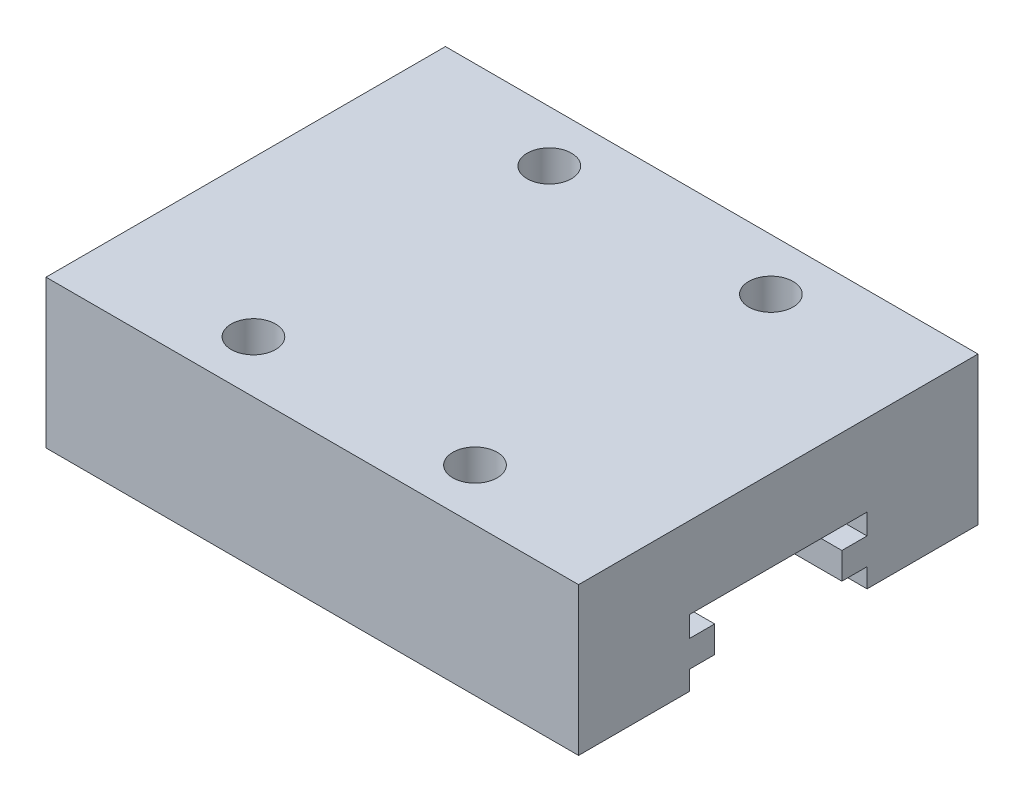
ISO-10303-21;
HEADER;
FILE_DESCRIPTION(('STEP AP214'),'2;1');
FILE_NAME('part.step','',(''),(''),'','','');
FILE_SCHEMA(('AUTOMOTIVE_DESIGN { 1 0 10303 214 1 1 1 1 }'));
ENDSEC;
DATA;
#1=APPLICATION_CONTEXT('core data for automotive mechanical design processes');
#2=APPLICATION_PROTOCOL_DEFINITION('international standard','automotive_design',2000,#1);
#3=PRODUCT_CONTEXT('',#1,'mechanical');
#4=PRODUCT('Part','Part','',(#3));
#5=PRODUCT_RELATED_PRODUCT_CATEGORY('part','',(#4));
#6=PRODUCT_DEFINITION_FORMATION('','',#4);
#7=PRODUCT_DEFINITION_CONTEXT('part definition',#1,'design');
#8=PRODUCT_DEFINITION('design','',#6,#7);
#9=PRODUCT_DEFINITION_SHAPE('','',#8);
#10=(LENGTH_UNIT() NAMED_UNIT(*) SI_UNIT(.MILLI.,.METRE.));
#11=(NAMED_UNIT(*) PLANE_ANGLE_UNIT() SI_UNIT($,.RADIAN.));
#12=(NAMED_UNIT(*) SI_UNIT($,.STERADIAN.) SOLID_ANGLE_UNIT());
#13=UNCERTAINTY_MEASURE_WITH_UNIT(LENGTH_MEASURE(1.E-05),#10,'distance_accuracy_value','');
#14=(GEOMETRIC_REPRESENTATION_CONTEXT(3) GLOBAL_UNCERTAINTY_ASSIGNED_CONTEXT((#13)) GLOBAL_UNIT_ASSIGNED_CONTEXT((#10,
#11,#12)) REPRESENTATION_CONTEXT('',''));
#15=CARTESIAN_POINT('',(0.,0.,0.));
#16=DIRECTION('',(0.,0.,1.));
#17=DIRECTION('',(1.,0.,0.));
#18=AXIS2_PLACEMENT_3D('',#15,#16,#17);
#19=CARTESIAN_POINT('',(0.,0.,0.));
#20=DIRECTION('',(0.,-1.,0.));
#21=DIRECTION('',(0.,0.,-1.));
#22=AXIS2_PLACEMENT_3D('',#19,#20,#21);
#23=PLANE('',#22);
#24=DIRECTION('',(1.,0.,0.));
#25=VECTOR('',#24,1.);
#26=CARTESIAN_POINT('',(-12.8160056179763,0.,-7.5));
#27=LINE('',#26,#25);
#28=CARTESIAN_POINT('',(0.,0.,-7.5));
#29=VERTEX_POINT('',#28);
#30=CARTESIAN_POINT('',(36.,0.,-7.5));
#31=VERTEX_POINT('',#30);
#32=EDGE_CURVE('E198',#29,#31,#27,.T.);
#33=ORIENTED_EDGE('',*,*,#32,.T.);
#34=DIRECTION('',(0.,0.,-1.));
#35=VECTOR('',#34,1.);
#36=CARTESIAN_POINT('',(36.,0.,0.));
#37=LINE('',#36,#35);
#38=CARTESIAN_POINT('',(36.,0.,0.));
#39=VERTEX_POINT('',#38);
#40=EDGE_CURVE('E213',#39,#31,#37,.T.);
#41=ORIENTED_EDGE('',*,*,#40,.F.);
#42=DIRECTION('',(1.,0.,0.));
#43=VECTOR('',#42,1.);
#44=CARTESIAN_POINT('',(0.,0.,0.));
#45=LINE('',#44,#43);
#46=CARTESIAN_POINT('',(0.,0.,0.));
#47=VERTEX_POINT('',#46);
#48=EDGE_CURVE('E230',#47,#39,#45,.T.);
#49=ORIENTED_EDGE('',*,*,#48,.F.);
#50=DIRECTION('',(0.,0.,1.));
#51=VECTOR('',#50,1.);
#52=CARTESIAN_POINT('',(0.,0.,0.));
#53=LINE('',#52,#51);
#54=EDGE_CURVE('E214',#29,#47,#53,.T.);
#55=ORIENTED_EDGE('',*,*,#54,.F.);
#56=EDGE_LOOP('',(#33,#41,#49,#55));
#57=FACE_BOUND('',#56,.T.);
#58=ADVANCED_FACE('F40',(#57),#23,.T.);
#59=CARTESIAN_POINT('',(0.,10.,0.));
#60=DIRECTION('',(1.,0.,0.));
#61=DIRECTION('',(0.,0.,-1.));
#62=AXIS2_PLACEMENT_3D('',#59,#60,#61);
#63=PLANE('',#62);
#64=DIRECTION('',(0.,0.,-1.));
#65=VECTOR('',#64,1.);
#66=CARTESIAN_POINT('',(0.,1.3,-7.5));
#67=LINE('',#66,#65);
#68=CARTESIAN_POINT('',(0.,1.3,-7.5));
#69=VERTEX_POINT('',#68);
#70=CARTESIAN_POINT('',(0.,1.3,-9.2));
#71=VERTEX_POINT('',#70);
#72=EDGE_CURVE('E365',#69,#71,#67,.T.);
#73=ORIENTED_EDGE('',*,*,#72,.F.);
#74=DIRECTION('',(0.,1.,0.));
#75=VECTOR('',#74,1.);
#76=CARTESIAN_POINT('',(0.,0.,-7.5));
#77=LINE('',#76,#75);
#78=EDGE_CURVE('E293',#29,#69,#77,.T.);
#79=ORIENTED_EDGE('',*,*,#78,.F.);
#80=ORIENTED_EDGE('',*,*,#54,.T.);
#81=DIRECTION('',(0.,-1.,0.));
#82=VECTOR('',#81,1.);
#83=CARTESIAN_POINT('',(0.,10.,0.));
#84=LINE('',#83,#82);
#85=CARTESIAN_POINT('',(0.,10.,0.));
#86=VERTEX_POINT('',#85);
#87=EDGE_CURVE('E11',#86,#47,#84,.T.);
#88=ORIENTED_EDGE('',*,*,#87,.F.);
#89=DIRECTION('',(0.,0.,1.));
#90=VECTOR('',#89,1.);
#91=CARTESIAN_POINT('',(0.,10.,0.));
#92=LINE('',#91,#90);
#93=CARTESIAN_POINT('',(0.,10.,-27.));
#94=VERTEX_POINT('',#93);
#95=EDGE_CURVE('E227',#94,#86,#92,.T.);
#96=ORIENTED_EDGE('',*,*,#95,.F.);
#97=DIRECTION('',(0.,-1.,0.));
#98=VECTOR('',#97,1.);
#99=CARTESIAN_POINT('',(0.,10.,-27.));
#100=LINE('',#99,#98);
#101=CARTESIAN_POINT('',(0.,0.,-27.));
#102=VERTEX_POINT('',#101);
#103=EDGE_CURVE('E234',#94,#102,#100,.T.);
#104=ORIENTED_EDGE('',*,*,#103,.T.);
#105=CARTESIAN_POINT('',(0.,0.,-19.5));
#106=VERTEX_POINT('',#105);
#107=EDGE_CURVE('E248',#102,#106,#53,.T.);
#108=ORIENTED_EDGE('',*,*,#107,.T.);
#109=DIRECTION('',(0.,-1.,0.));
#110=VECTOR('',#109,1.);
#111=CARTESIAN_POINT('',(0.,0.,-19.5));
#112=LINE('',#111,#110);
#113=CARTESIAN_POINT('',(0.,1.3,-19.5));
#114=VERTEX_POINT('',#113);
#115=EDGE_CURVE('E59',#114,#106,#112,.T.);
#116=ORIENTED_EDGE('',*,*,#115,.F.);
#117=DIRECTION('',(0.,0.,-1.));
#118=VECTOR('',#117,1.);
#119=CARTESIAN_POINT('',(0.,1.3,-19.5));
#120=LINE('',#119,#118);
#121=CARTESIAN_POINT('',(0.,1.3,-17.8));
#122=VERTEX_POINT('',#121);
#123=EDGE_CURVE('E389',#122,#114,#120,.T.);
#124=ORIENTED_EDGE('',*,*,#123,.F.);
#125=DIRECTION('',(0.,-1.,0.));
#126=VECTOR('',#125,1.);
#127=CARTESIAN_POINT('',(0.,3.1,-17.8));
#128=LINE('',#127,#126);
#129=CARTESIAN_POINT('',(0.,3.1,-17.8));
#130=VERTEX_POINT('',#129);
#131=EDGE_CURVE('E386',#130,#122,#128,.T.);
#132=ORIENTED_EDGE('',*,*,#131,.F.);
#133=DIRECTION('',(0.,0.,1.));
#134=VECTOR('',#133,1.);
#135=CARTESIAN_POINT('',(0.,3.1,-19.5));
#136=LINE('',#135,#134);
#137=CARTESIAN_POINT('',(0.,3.1,-19.5));
#138=VERTEX_POINT('',#137);
#139=EDGE_CURVE('E383',#138,#130,#136,.T.);
#140=ORIENTED_EDGE('',*,*,#139,.F.);
#141=DIRECTION('',(0.,-1.,0.));
#142=VECTOR('',#141,1.);
#143=CARTESIAN_POINT('',(0.,3.1,-19.5));
#144=LINE('',#143,#142);
#145=CARTESIAN_POINT('',(0.,4.5,-19.5));
#146=VERTEX_POINT('',#145);
#147=EDGE_CURVE('E380',#146,#138,#144,.T.);
#148=ORIENTED_EDGE('',*,*,#147,.F.);
#149=DIRECTION('',(0.,0.,-1.));
#150=VECTOR('',#149,1.);
#151=CARTESIAN_POINT('',(0.,4.5,-7.5));
#152=LINE('',#151,#150);
#153=CARTESIAN_POINT('',(0.,4.5,-7.5));
#154=VERTEX_POINT('',#153);
#155=EDGE_CURVE('E377',#154,#146,#152,.T.);
#156=ORIENTED_EDGE('',*,*,#155,.F.);
#157=DIRECTION('',(0.,1.,0.));
#158=VECTOR('',#157,1.);
#159=CARTESIAN_POINT('',(0.,3.1,-7.5));
#160=LINE('',#159,#158);
#161=CARTESIAN_POINT('',(0.,3.1,-7.5));
#162=VERTEX_POINT('',#161);
#163=EDGE_CURVE('E374',#162,#154,#160,.T.);
#164=ORIENTED_EDGE('',*,*,#163,.F.);
#165=DIRECTION('',(0.,0.,1.));
#166=VECTOR('',#165,1.);
#167=CARTESIAN_POINT('',(0.,3.1,-7.5));
#168=LINE('',#167,#166);
#169=CARTESIAN_POINT('',(0.,3.1,-9.2));
#170=VERTEX_POINT('',#169);
#171=EDGE_CURVE('E371',#170,#162,#168,.T.);
#172=ORIENTED_EDGE('',*,*,#171,.F.);
#173=DIRECTION('',(0.,1.,0.));
#174=VECTOR('',#173,1.);
#175=CARTESIAN_POINT('',(0.,3.1,-9.2));
#176=LINE('',#175,#174);
#177=EDGE_CURVE('E368',#71,#170,#176,.T.);
#178=ORIENTED_EDGE('',*,*,#177,.F.);
#179=EDGE_LOOP('',(#73,#79,#80,#88,#96,#104,#108,#116,#124,#132,#140,#148,#156,#164,#172,#178));
#180=FACE_BOUND('',#179,.T.);
#181=ADVANCED_FACE('F42',(#180),#63,.F.);
#182=CARTESIAN_POINT('',(0.,10.,0.));
#183=DIRECTION('',(0.,0.,-1.));
#184=DIRECTION('',(-1.,0.,0.));
#185=AXIS2_PLACEMENT_3D('',#182,#183,#184);
#186=PLANE('',#185);
#187=ORIENTED_EDGE('',*,*,#48,.T.);
#188=DIRECTION('',(0.,-1.,0.));
#189=VECTOR('',#188,1.);
#190=CARTESIAN_POINT('',(36.,10.,0.));
#191=LINE('',#190,#189);
#192=CARTESIAN_POINT('',(36.,10.,0.));
#193=VERTEX_POINT('',#192);
#194=EDGE_CURVE('E49',#193,#39,#191,.T.);
#195=ORIENTED_EDGE('',*,*,#194,.F.);
#196=DIRECTION('',(1.,0.,0.));
#197=VECTOR('',#196,1.);
#198=CARTESIAN_POINT('',(0.,10.,0.));
#199=LINE('',#198,#197);
#200=EDGE_CURVE('E105',#86,#193,#199,.T.);
#201=ORIENTED_EDGE('',*,*,#200,.F.);
#202=ORIENTED_EDGE('',*,*,#87,.T.);
#203=EDGE_LOOP('',(#187,#195,#201,#202));
#204=FACE_BOUND('',#203,.T.);
#205=ADVANCED_FACE('F403',(#204),#186,.F.);
#206=CARTESIAN_POINT('',(36.,10.,0.));
#207=DIRECTION('',(-1.,0.,0.));
#208=DIRECTION('',(0.,0.,1.));
#209=AXIS2_PLACEMENT_3D('',#206,#207,#208);
#210=PLANE('',#209);
#211=ORIENTED_EDGE('',*,*,#40,.T.);
#212=DIRECTION('',(0.,-1.,0.));
#213=VECTOR('',#212,1.);
#214=CARTESIAN_POINT('',(36.,0.,-7.5));
#215=LINE('',#214,#213);
#216=CARTESIAN_POINT('',(36.,1.3,-7.5));
#217=VERTEX_POINT('',#216);
#218=EDGE_CURVE('E195',#217,#31,#215,.T.);
#219=ORIENTED_EDGE('',*,*,#218,.F.);
#220=DIRECTION('',(0.,0.,1.));
#221=VECTOR('',#220,1.);
#222=CARTESIAN_POINT('',(36.,1.3,-7.5));
#223=LINE('',#222,#221);
#224=CARTESIAN_POINT('',(36.,1.3,-9.2));
#225=VERTEX_POINT('',#224);
#226=EDGE_CURVE('E217',#225,#217,#223,.T.);
#227=ORIENTED_EDGE('',*,*,#226,.F.);
#228=DIRECTION('',(0.,-1.,0.));
#229=VECTOR('',#228,1.);
#230=CARTESIAN_POINT('',(36.,3.1,-9.2));
#231=LINE('',#230,#229);
#232=CARTESIAN_POINT('',(36.,3.1,-9.2));
#233=VERTEX_POINT('',#232);
#234=EDGE_CURVE('E329',#233,#225,#231,.T.);
#235=ORIENTED_EDGE('',*,*,#234,.F.);
#236=DIRECTION('',(0.,0.,-1.));
#237=VECTOR('',#236,1.);
#238=CARTESIAN_POINT('',(36.,3.1,-7.5));
#239=LINE('',#238,#237);
#240=CARTESIAN_POINT('',(36.,3.1,-7.5));
#241=VERTEX_POINT('',#240);
#242=EDGE_CURVE('E332',#241,#233,#239,.T.);
#243=ORIENTED_EDGE('',*,*,#242,.F.);
#244=DIRECTION('',(0.,-1.,0.));
#245=VECTOR('',#244,1.);
#246=CARTESIAN_POINT('',(36.,3.1,-7.5));
#247=LINE('',#246,#245);
#248=CARTESIAN_POINT('',(36.,4.5,-7.5));
#249=VERTEX_POINT('',#248);
#250=EDGE_CURVE('E336',#249,#241,#247,.T.);
#251=ORIENTED_EDGE('',*,*,#250,.F.);
#252=DIRECTION('',(0.,0.,1.));
#253=VECTOR('',#252,1.);
#254=CARTESIAN_POINT('',(36.,4.5,-7.5));
#255=LINE('',#254,#253);
#256=CARTESIAN_POINT('',(36.,4.5,-19.5));
#257=VERTEX_POINT('',#256);
#258=EDGE_CURVE('E340',#257,#249,#255,.T.);
#259=ORIENTED_EDGE('',*,*,#258,.F.);
#260=DIRECTION('',(0.,1.,0.));
#261=VECTOR('',#260,1.);
#262=CARTESIAN_POINT('',(36.,3.1,-19.5));
#263=LINE('',#262,#261);
#264=CARTESIAN_POINT('',(36.,3.1,-19.5));
#265=VERTEX_POINT('',#264);
#266=EDGE_CURVE('E344',#265,#257,#263,.T.);
#267=ORIENTED_EDGE('',*,*,#266,.F.);
#268=DIRECTION('',(0.,0.,-1.));
#269=VECTOR('',#268,1.);
#270=CARTESIAN_POINT('',(36.,3.1,-19.5));
#271=LINE('',#270,#269);
#272=CARTESIAN_POINT('',(36.,3.1,-17.8));
#273=VERTEX_POINT('',#272);
#274=EDGE_CURVE('E348',#273,#265,#271,.T.);
#275=ORIENTED_EDGE('',*,*,#274,.F.);
#276=DIRECTION('',(0.,1.,0.));
#277=VECTOR('',#276,1.);
#278=CARTESIAN_POINT('',(36.,3.1,-17.8));
#279=LINE('',#278,#277);
#280=CARTESIAN_POINT('',(36.,1.3,-17.8));
#281=VERTEX_POINT('',#280);
#282=EDGE_CURVE('E352',#281,#273,#279,.T.);
#283=ORIENTED_EDGE('',*,*,#282,.F.);
#284=DIRECTION('',(0.,0.,1.));
#285=VECTOR('',#284,1.);
#286=CARTESIAN_POINT('',(36.,1.3,-19.5));
#287=LINE('',#286,#285);
#288=CARTESIAN_POINT('',(36.,1.3,-19.5));
#289=VERTEX_POINT('',#288);
#290=EDGE_CURVE('E356',#289,#281,#287,.T.);
#291=ORIENTED_EDGE('',*,*,#290,.F.);
#292=DIRECTION('',(0.,1.,0.));
#293=VECTOR('',#292,1.);
#294=CARTESIAN_POINT('',(36.,0.,-19.5));
#295=LINE('',#294,#293);
#296=CARTESIAN_POINT('',(36.,0.,-19.5));
#297=VERTEX_POINT('',#296);
#298=EDGE_CURVE('E207',#297,#289,#295,.T.);
#299=ORIENTED_EDGE('',*,*,#298,.F.);
#300=CARTESIAN_POINT('',(36.,0.,-27.));
#301=VERTEX_POINT('',#300);
#302=EDGE_CURVE('E223',#297,#301,#37,.T.);
#303=ORIENTED_EDGE('',*,*,#302,.T.);
#304=DIRECTION('',(0.,-1.,0.));
#305=VECTOR('',#304,1.);
#306=CARTESIAN_POINT('',(36.,10.,-27.));
#307=LINE('',#306,#305);
#308=CARTESIAN_POINT('',(36.,10.,-27.));
#309=VERTEX_POINT('',#308);
#310=EDGE_CURVE('E237',#309,#301,#307,.T.);
#311=ORIENTED_EDGE('',*,*,#310,.F.);
#312=DIRECTION('',(0.,0.,-1.));
#313=VECTOR('',#312,1.);
#314=CARTESIAN_POINT('',(36.,10.,0.));
#315=LINE('',#314,#313);
#316=EDGE_CURVE('E259',#193,#309,#315,.T.);
#317=ORIENTED_EDGE('',*,*,#316,.F.);
#318=ORIENTED_EDGE('',*,*,#194,.T.);
#319=EDGE_LOOP('',(#211,#219,#227,#235,#243,#251,#259,#267,#275,#283,#291,#299,#303,#311,#317,#318));
#320=FACE_BOUND('',#319,.T.);
#321=ADVANCED_FACE('F220',(#320),#210,.F.);
#322=CARTESIAN_POINT('',(0.,10.,-27.));
#323=DIRECTION('',(0.,0.,1.));
#324=DIRECTION('',(1.,0.,0.));
#325=AXIS2_PLACEMENT_3D('',#322,#323,#324);
#326=PLANE('',#325);
#327=DIRECTION('',(-1.,0.,0.));
#328=VECTOR('',#327,1.);
#329=CARTESIAN_POINT('',(0.,0.,-27.));
#330=LINE('',#329,#328);
#331=EDGE_CURVE('E97',#301,#102,#330,.T.);
#332=ORIENTED_EDGE('',*,*,#331,.T.);
#333=ORIENTED_EDGE('',*,*,#103,.F.);
#334=DIRECTION('',(-1.,0.,0.));
#335=VECTOR('',#334,1.);
#336=CARTESIAN_POINT('',(0.,10.,-27.));
#337=LINE('',#336,#335);
#338=EDGE_CURVE('E70',#309,#94,#337,.T.);
#339=ORIENTED_EDGE('',*,*,#338,.F.);
#340=ORIENTED_EDGE('',*,*,#310,.T.);
#341=EDGE_LOOP('',(#332,#333,#339,#340));
#342=FACE_BOUND('',#341,.T.);
#343=ADVANCED_FACE('F242',(#342),#326,.F.);
#344=CARTESIAN_POINT('',(0.,10.,0.));
#345=DIRECTION('',(0.,-1.,0.));
#346=DIRECTION('',(0.,0.,-1.));
#347=AXIS2_PLACEMENT_3D('',#344,#345,#346);
#348=PLANE('',#347);
#349=CARTESIAN_POINT('',(25.4999864669187,10.,-23.5));
#350=DIRECTION('',(0.,1.,0.));
#351=DIRECTION('',(0.,0.,1.));
#352=AXIS2_PLACEMENT_3D('',#349,#350,#351);
#353=CIRCLE('',#352,1.5);
#354=CARTESIAN_POINT('',(25.4999864669187,10.,-22.));
#355=VERTEX_POINT('',#354);
#356=EDGE_CURVE('E282',#355,#355,#353,.T.);
#357=ORIENTED_EDGE('',*,*,#356,.F.);
#358=EDGE_LOOP('',(#357));
#359=FACE_BOUND('',#358,.T.);
#360=CARTESIAN_POINT('',(10.5,10.,-3.52014924954561));
#361=DIRECTION('',(0.,1.,0.));
#362=DIRECTION('',(0.,0.,1.));
#363=AXIS2_PLACEMENT_3D('',#360,#361,#362);
#364=CIRCLE('',#363,1.5);
#365=CARTESIAN_POINT('',(10.5,10.,-2.02014924954561));
#366=VERTEX_POINT('',#365);
#367=EDGE_CURVE('E273',#366,#366,#364,.T.);
#368=ORIENTED_EDGE('',*,*,#367,.F.);
#369=EDGE_LOOP('',(#368));
#370=FACE_BOUND('',#369,.T.);
#371=CARTESIAN_POINT('',(25.4999864669187,10.,-3.5));
#372=DIRECTION('',(0.,1.,0.));
#373=DIRECTION('',(0.,0.,1.));
#374=AXIS2_PLACEMENT_3D('',#371,#372,#373);
#375=CIRCLE('',#374,1.5);
#376=CARTESIAN_POINT('',(25.4999864669187,10.,-2.));
#377=VERTEX_POINT('',#376);
#378=EDGE_CURVE('E289',#377,#377,#375,.T.);
#379=ORIENTED_EDGE('',*,*,#378,.F.);
#380=EDGE_LOOP('',(#379));
#381=FACE_BOUND('',#380,.T.);
#382=CARTESIAN_POINT('',(10.5,10.,-23.5201492495456));
#383=DIRECTION('',(0.,1.,0.));
#384=DIRECTION('',(0.,0.,1.));
#385=AXIS2_PLACEMENT_3D('',#382,#383,#384);
#386=CIRCLE('',#385,1.5);
#387=CARTESIAN_POINT('',(10.5,10.,-22.0201492495456));
#388=VERTEX_POINT('',#387);
#389=EDGE_CURVE('E265',#388,#388,#386,.T.);
#390=ORIENTED_EDGE('',*,*,#389,.F.);
#391=EDGE_LOOP('',(#390));
#392=FACE_BOUND('',#391,.T.);
#393=ORIENTED_EDGE('',*,*,#95,.T.);
#394=ORIENTED_EDGE('',*,*,#200,.T.);
#395=ORIENTED_EDGE('',*,*,#316,.T.);
#396=ORIENTED_EDGE('',*,*,#338,.T.);
#397=EDGE_LOOP('',(#393,#394,#395,#396));
#398=FACE_BOUND('',#397,.T.);
#399=ADVANCED_FACE('F415',(#359,#370,#381,#392,#398),#348,.F.);
#400=DIRECTION('',(1.,0.,0.));
#401=VECTOR('',#400,1.);
#402=CARTESIAN_POINT('',(-12.8160056179763,0.,-19.5));
#403=LINE('',#402,#401);
#404=EDGE_CURVE('E216',#106,#297,#403,.T.);
#405=ORIENTED_EDGE('',*,*,#404,.F.);
#406=ORIENTED_EDGE('',*,*,#107,.F.);
#407=ORIENTED_EDGE('',*,*,#331,.F.);
#408=ORIENTED_EDGE('',*,*,#302,.F.);
#409=EDGE_LOOP('',(#405,#406,#407,#408));
#410=FACE_BOUND('',#409,.T.);
#411=ADVANCED_FACE('F246',(#410),#23,.T.);
#412=CARTESIAN_POINT('',(10.5,5.,-23.5201492495456));
#413=DIRECTION('',(0.,1.,0.));
#414=DIRECTION('',(0.,0.,1.));
#415=AXIS2_PLACEMENT_3D('',#412,#413,#414);
#416=CYLINDRICAL_SURFACE('',#415,1.5);
#417=CARTESIAN_POINT('',(10.5,5.,-23.5201492495456));
#418=DIRECTION('',(0.,1.,0.));
#419=DIRECTION('',(0.,0.,1.));
#420=AXIS2_PLACEMENT_3D('',#417,#418,#419);
#421=CIRCLE('',#420,1.5);
#422=CARTESIAN_POINT('',(10.5,5.,-22.0201492495456));
#423=VERTEX_POINT('',#422);
#424=EDGE_CURVE('E255',#423,#423,#421,.T.);
#425=ORIENTED_EDGE('',*,*,#424,.F.);
#426=EDGE_LOOP('',(#425));
#427=FACE_BOUND('',#426,.T.);
#428=ORIENTED_EDGE('',*,*,#389,.T.);
#429=EDGE_LOOP('',(#428));
#430=FACE_BOUND('',#429,.T.);
#431=ADVANCED_FACE('F414',(#427,#430),#416,.F.);
#432=CARTESIAN_POINT('',(10.5,5.,-23.5201492495456));
#433=DIRECTION('',(0.,1.,0.));
#434=DIRECTION('',(0.,0.,1.));
#435=AXIS2_PLACEMENT_3D('',#432,#433,#434);
#436=PLANE('',#435);
#437=ORIENTED_EDGE('',*,*,#424,.T.);
#438=EDGE_LOOP('',(#437));
#439=FACE_BOUND('',#438,.T.);
#440=ADVANCED_FACE('F420',(#439),#436,.T.);
#441=CARTESIAN_POINT('',(25.4999864669187,5.,-3.5));
#442=DIRECTION('',(0.,1.,0.));
#443=DIRECTION('',(0.,0.,1.));
#444=AXIS2_PLACEMENT_3D('',#441,#442,#443);
#445=CYLINDRICAL_SURFACE('',#444,1.5);
#446=CARTESIAN_POINT('',(25.4999864669187,5.,-3.5));
#447=DIRECTION('',(0.,1.,0.));
#448=DIRECTION('',(0.,0.,1.));
#449=AXIS2_PLACEMENT_3D('',#446,#447,#448);
#450=CIRCLE('',#449,1.5);
#451=CARTESIAN_POINT('',(25.4999864669187,5.,-2.));
#452=VERTEX_POINT('',#451);
#453=EDGE_CURVE('E278',#452,#452,#450,.T.);
#454=ORIENTED_EDGE('',*,*,#453,.F.);
#455=EDGE_LOOP('',(#454));
#456=FACE_BOUND('',#455,.T.);
#457=ORIENTED_EDGE('',*,*,#378,.T.);
#458=EDGE_LOOP('',(#457));
#459=FACE_BOUND('',#458,.T.);
#460=ADVANCED_FACE('F432',(#456,#459),#445,.F.);
#461=CARTESIAN_POINT('',(25.4999864669187,5.,-3.5));
#462=DIRECTION('',(0.,1.,0.));
#463=DIRECTION('',(0.,0.,1.));
#464=AXIS2_PLACEMENT_3D('',#461,#462,#463);
#465=PLANE('',#464);
#466=ORIENTED_EDGE('',*,*,#453,.T.);
#467=EDGE_LOOP('',(#466));
#468=FACE_BOUND('',#467,.T.);
#469=ADVANCED_FACE('F438',(#468),#465,.T.);
#470=CARTESIAN_POINT('',(10.5,5.,-3.52014924954561));
#471=DIRECTION('',(0.,1.,0.));
#472=DIRECTION('',(0.,0.,1.));
#473=AXIS2_PLACEMENT_3D('',#470,#471,#472);
#474=CYLINDRICAL_SURFACE('',#473,1.5);
#475=CARTESIAN_POINT('',(10.5,5.,-3.52014924954561));
#476=DIRECTION('',(0.,1.,0.));
#477=DIRECTION('',(0.,0.,1.));
#478=AXIS2_PLACEMENT_3D('',#475,#476,#477);
#479=CIRCLE('',#478,1.5);
#480=CARTESIAN_POINT('',(10.5,5.,-2.02014924954561));
#481=VERTEX_POINT('',#480);
#482=EDGE_CURVE('E277',#481,#481,#479,.T.);
#483=ORIENTED_EDGE('',*,*,#482,.F.);
#484=EDGE_LOOP('',(#483));
#485=FACE_BOUND('',#484,.T.);
#486=ORIENTED_EDGE('',*,*,#367,.T.);
#487=EDGE_LOOP('',(#486));
#488=FACE_BOUND('',#487,.T.);
#489=ADVANCED_FACE('F434',(#485,#488),#474,.F.);
#490=CARTESIAN_POINT('',(10.5,5.,-3.52014924954561));
#491=DIRECTION('',(0.,1.,0.));
#492=DIRECTION('',(0.,0.,1.));
#493=AXIS2_PLACEMENT_3D('',#490,#491,#492);
#494=PLANE('',#493);
#495=ORIENTED_EDGE('',*,*,#482,.T.);
#496=EDGE_LOOP('',(#495));
#497=FACE_BOUND('',#496,.T.);
#498=ADVANCED_FACE('F437',(#497),#494,.T.);
#499=CARTESIAN_POINT('',(25.4999864669187,5.,-23.5));
#500=DIRECTION('',(0.,1.,0.));
#501=DIRECTION('',(0.,0.,1.));
#502=AXIS2_PLACEMENT_3D('',#499,#500,#501);
#503=CYLINDRICAL_SURFACE('',#502,1.5);
#504=CARTESIAN_POINT('',(25.4999864669187,5.,-23.5));
#505=DIRECTION('',(0.,1.,0.));
#506=DIRECTION('',(0.,0.,1.));
#507=AXIS2_PLACEMENT_3D('',#504,#505,#506);
#508=CIRCLE('',#507,1.5);
#509=CARTESIAN_POINT('',(25.4999864669187,5.,-22.));
#510=VERTEX_POINT('',#509);
#511=EDGE_CURVE('E269',#510,#510,#508,.T.);
#512=ORIENTED_EDGE('',*,*,#511,.F.);
#513=EDGE_LOOP('',(#512));
#514=FACE_BOUND('',#513,.T.);
#515=ORIENTED_EDGE('',*,*,#356,.T.);
#516=EDGE_LOOP('',(#515));
#517=FACE_BOUND('',#516,.T.);
#518=ADVANCED_FACE('F442',(#514,#517),#503,.F.);
#519=CARTESIAN_POINT('',(25.4999864669187,5.,-23.5));
#520=DIRECTION('',(0.,1.,0.));
#521=DIRECTION('',(0.,0.,1.));
#522=AXIS2_PLACEMENT_3D('',#519,#520,#521);
#523=PLANE('',#522);
#524=ORIENTED_EDGE('',*,*,#511,.T.);
#525=EDGE_LOOP('',(#524));
#526=FACE_BOUND('',#525,.T.);
#527=ADVANCED_FACE('F446',(#526),#523,.T.);
#528=CARTESIAN_POINT('',(-12.8160056179763,0.,-7.5));
#529=DIRECTION('',(0.,0.,1.));
#530=DIRECTION('',(0.,-1.,0.));
#531=AXIS2_PLACEMENT_3D('',#528,#529,#530);
#532=PLANE('',#531);
#533=ORIENTED_EDGE('',*,*,#78,.T.);
#534=DIRECTION('',(1.,0.,0.));
#535=VECTOR('',#534,1.);
#536=CARTESIAN_POINT('',(-12.8160056179763,1.3,-7.5));
#537=LINE('',#536,#535);
#538=EDGE_CURVE('E201',#69,#217,#537,.T.);
#539=ORIENTED_EDGE('',*,*,#538,.T.);
#540=ORIENTED_EDGE('',*,*,#218,.T.);
#541=ORIENTED_EDGE('',*,*,#32,.F.);
#542=EDGE_LOOP('',(#533,#539,#540,#541));
#543=FACE_BOUND('',#542,.T.);
#544=ADVANCED_FACE('F197',(#543),#532,.F.);
#545=CARTESIAN_POINT('',(-12.8160056179763,1.3,-7.5));
#546=DIRECTION('',(0.,1.,0.));
#547=DIRECTION('',(0.,0.,1.));
#548=AXIS2_PLACEMENT_3D('',#545,#546,#547);
#549=PLANE('',#548);
#550=ORIENTED_EDGE('',*,*,#72,.T.);
#551=DIRECTION('',(1.,0.,0.));
#552=VECTOR('',#551,1.);
#553=CARTESIAN_POINT('',(-12.8160056179763,1.3,-9.2));
#554=LINE('',#553,#552);
#555=EDGE_CURVE('E322',#71,#225,#554,.T.);
#556=ORIENTED_EDGE('',*,*,#555,.T.);
#557=ORIENTED_EDGE('',*,*,#226,.T.);
#558=ORIENTED_EDGE('',*,*,#538,.F.);
#559=EDGE_LOOP('',(#550,#556,#557,#558));
#560=FACE_BOUND('',#559,.T.);
#561=ADVANCED_FACE('F459',(#560),#549,.F.);
#562=CARTESIAN_POINT('',(-12.8160056179763,3.1,-9.2));
#563=DIRECTION('',(0.,0.,1.));
#564=DIRECTION('',(0.,-1.,0.));
#565=AXIS2_PLACEMENT_3D('',#562,#563,#564);
#566=PLANE('',#565);
#567=ORIENTED_EDGE('',*,*,#177,.T.);
#568=DIRECTION('',(1.,0.,0.));
#569=VECTOR('',#568,1.);
#570=CARTESIAN_POINT('',(-12.8160056179763,3.1,-9.2));
#571=LINE('',#570,#569);
#572=EDGE_CURVE('E319',#170,#233,#571,.T.);
#573=ORIENTED_EDGE('',*,*,#572,.T.);
#574=ORIENTED_EDGE('',*,*,#234,.T.);
#575=ORIENTED_EDGE('',*,*,#555,.F.);
#576=EDGE_LOOP('',(#567,#573,#574,#575));
#577=FACE_BOUND('',#576,.T.);
#578=ADVANCED_FACE('F487',(#577),#566,.F.);
#579=CARTESIAN_POINT('',(-12.8160056179763,3.1,-7.5));
#580=DIRECTION('',(0.,-1.,0.));
#581=DIRECTION('',(0.,0.,-1.));
#582=AXIS2_PLACEMENT_3D('',#579,#580,#581);
#583=PLANE('',#582);
#584=ORIENTED_EDGE('',*,*,#171,.T.);
#585=DIRECTION('',(1.,0.,0.));
#586=VECTOR('',#585,1.);
#587=CARTESIAN_POINT('',(-12.8160056179763,3.1,-7.5));
#588=LINE('',#587,#586);
#589=EDGE_CURVE('E316',#162,#241,#588,.T.);
#590=ORIENTED_EDGE('',*,*,#589,.T.);
#591=ORIENTED_EDGE('',*,*,#242,.T.);
#592=ORIENTED_EDGE('',*,*,#572,.F.);
#593=EDGE_LOOP('',(#584,#590,#591,#592));
#594=FACE_BOUND('',#593,.T.);
#595=ADVANCED_FACE('F483',(#594),#583,.F.);
#596=CARTESIAN_POINT('',(-12.8160056179763,3.1,-7.5));
#597=DIRECTION('',(0.,0.,1.));
#598=DIRECTION('',(0.,-1.,0.));
#599=AXIS2_PLACEMENT_3D('',#596,#597,#598);
#600=PLANE('',#599);
#601=ORIENTED_EDGE('',*,*,#163,.T.);
#602=DIRECTION('',(1.,0.,0.));
#603=VECTOR('',#602,1.);
#604=CARTESIAN_POINT('',(-12.8160056179763,4.5,-7.5));
#605=LINE('',#604,#603);
#606=EDGE_CURVE('E314',#154,#249,#605,.T.);
#607=ORIENTED_EDGE('',*,*,#606,.T.);
#608=ORIENTED_EDGE('',*,*,#250,.T.);
#609=ORIENTED_EDGE('',*,*,#589,.F.);
#610=EDGE_LOOP('',(#601,#607,#608,#609));
#611=FACE_BOUND('',#610,.T.);
#612=ADVANCED_FACE('F479',(#611),#600,.F.);
#613=CARTESIAN_POINT('',(-12.8160056179763,4.5,-7.5));
#614=DIRECTION('',(0.,1.,0.));
#615=DIRECTION('',(0.,0.,1.));
#616=AXIS2_PLACEMENT_3D('',#613,#614,#615);
#617=PLANE('',#616);
#618=ORIENTED_EDGE('',*,*,#155,.T.);
#619=DIRECTION('',(1.,0.,0.));
#620=VECTOR('',#619,1.);
#621=CARTESIAN_POINT('',(-12.8160056179763,4.5,-19.5));
#622=LINE('',#621,#620);
#623=EDGE_CURVE('E311',#146,#257,#622,.T.);
#624=ORIENTED_EDGE('',*,*,#623,.T.);
#625=ORIENTED_EDGE('',*,*,#258,.T.);
#626=ORIENTED_EDGE('',*,*,#606,.F.);
#627=EDGE_LOOP('',(#618,#624,#625,#626));
#628=FACE_BOUND('',#627,.T.);
#629=ADVANCED_FACE('F475',(#628),#617,.F.);
#630=CARTESIAN_POINT('',(-12.8160056179763,3.1,-19.5));
#631=DIRECTION('',(0.,0.,-1.));
#632=DIRECTION('',(0.,1.,0.));
#633=AXIS2_PLACEMENT_3D('',#630,#631,#632);
#634=PLANE('',#633);
#635=ORIENTED_EDGE('',*,*,#147,.T.);
#636=DIRECTION('',(1.,0.,0.));
#637=VECTOR('',#636,1.);
#638=CARTESIAN_POINT('',(-12.8160056179763,3.1,-19.5));
#639=LINE('',#638,#637);
#640=EDGE_CURVE('E308',#138,#265,#639,.T.);
#641=ORIENTED_EDGE('',*,*,#640,.T.);
#642=ORIENTED_EDGE('',*,*,#266,.T.);
#643=ORIENTED_EDGE('',*,*,#623,.F.);
#644=EDGE_LOOP('',(#635,#641,#642,#643));
#645=FACE_BOUND('',#644,.T.);
#646=ADVANCED_FACE('F471',(#645),#634,.F.);
#647=CARTESIAN_POINT('',(-12.8160056179763,3.1,-19.5));
#648=DIRECTION('',(0.,-1.,0.));
#649=DIRECTION('',(0.,0.,-1.));
#650=AXIS2_PLACEMENT_3D('',#647,#648,#649);
#651=PLANE('',#650);
#652=ORIENTED_EDGE('',*,*,#139,.T.);
#653=DIRECTION('',(1.,0.,0.));
#654=VECTOR('',#653,1.);
#655=CARTESIAN_POINT('',(-12.8160056179763,3.1,-17.8));
#656=LINE('',#655,#654);
#657=EDGE_CURVE('E305',#130,#273,#656,.T.);
#658=ORIENTED_EDGE('',*,*,#657,.T.);
#659=ORIENTED_EDGE('',*,*,#274,.T.);
#660=ORIENTED_EDGE('',*,*,#640,.F.);
#661=EDGE_LOOP('',(#652,#658,#659,#660));
#662=FACE_BOUND('',#661,.T.);
#663=ADVANCED_FACE('F467',(#662),#651,.F.);
#664=CARTESIAN_POINT('',(-12.8160056179763,3.1,-17.8));
#665=DIRECTION('',(0.,0.,-1.));
#666=DIRECTION('',(0.,1.,0.));
#667=AXIS2_PLACEMENT_3D('',#664,#665,#666);
#668=PLANE('',#667);
#669=ORIENTED_EDGE('',*,*,#131,.T.);
#670=DIRECTION('',(1.,0.,0.));
#671=VECTOR('',#670,1.);
#672=CARTESIAN_POINT('',(-12.8160056179763,1.3,-17.8));
#673=LINE('',#672,#671);
#674=EDGE_CURVE('E302',#122,#281,#673,.T.);
#675=ORIENTED_EDGE('',*,*,#674,.T.);
#676=ORIENTED_EDGE('',*,*,#282,.T.);
#677=ORIENTED_EDGE('',*,*,#657,.F.);
#678=EDGE_LOOP('',(#669,#675,#676,#677));
#679=FACE_BOUND('',#678,.T.);
#680=ADVANCED_FACE('F464',(#679),#668,.F.);
#681=CARTESIAN_POINT('',(-12.8160056179763,1.3,-19.5));
#682=DIRECTION('',(0.,1.,0.));
#683=DIRECTION('',(0.,0.,1.));
#684=AXIS2_PLACEMENT_3D('',#681,#682,#683);
#685=PLANE('',#684);
#686=ORIENTED_EDGE('',*,*,#123,.T.);
#687=DIRECTION('',(1.,0.,0.));
#688=VECTOR('',#687,1.);
#689=CARTESIAN_POINT('',(-12.8160056179763,1.3,-19.5));
#690=LINE('',#689,#688);
#691=EDGE_CURVE('E299',#114,#289,#690,.T.);
#692=ORIENTED_EDGE('',*,*,#691,.T.);
#693=ORIENTED_EDGE('',*,*,#290,.T.);
#694=ORIENTED_EDGE('',*,*,#674,.F.);
#695=EDGE_LOOP('',(#686,#692,#693,#694));
#696=FACE_BOUND('',#695,.T.);
#697=ADVANCED_FACE('F395',(#696),#685,.F.);
#698=CARTESIAN_POINT('',(-12.8160056179763,0.,-19.5));
#699=DIRECTION('',(0.,0.,-1.));
#700=DIRECTION('',(0.,1.,0.));
#701=AXIS2_PLACEMENT_3D('',#698,#699,#700);
#702=PLANE('',#701);
#703=ORIENTED_EDGE('',*,*,#115,.T.);
#704=ORIENTED_EDGE('',*,*,#404,.T.);
#705=ORIENTED_EDGE('',*,*,#298,.T.);
#706=ORIENTED_EDGE('',*,*,#691,.F.);
#707=EDGE_LOOP('',(#703,#704,#705,#706));
#708=FACE_BOUND('',#707,.T.);
#709=ADVANCED_FACE('F397',(#708),#702,.F.);
#710=CLOSED_SHELL('',(#58,#181,#205,#321,#343,#399,#411,#431,#440,#460,#469,#489,#498,#518,#527,
#544,#561,#578,#595,#612,#629,#646,#663,#680,#697,#709));
#711=MANIFOLD_SOLID_BREP('B2',#710);
#712=ADVANCED_BREP_SHAPE_REPRESENTATION('',(#18,#711),#14);
#713=SHAPE_DEFINITION_REPRESENTATION(#9,#712);
ENDSEC;
END-ISO-10303-21;
